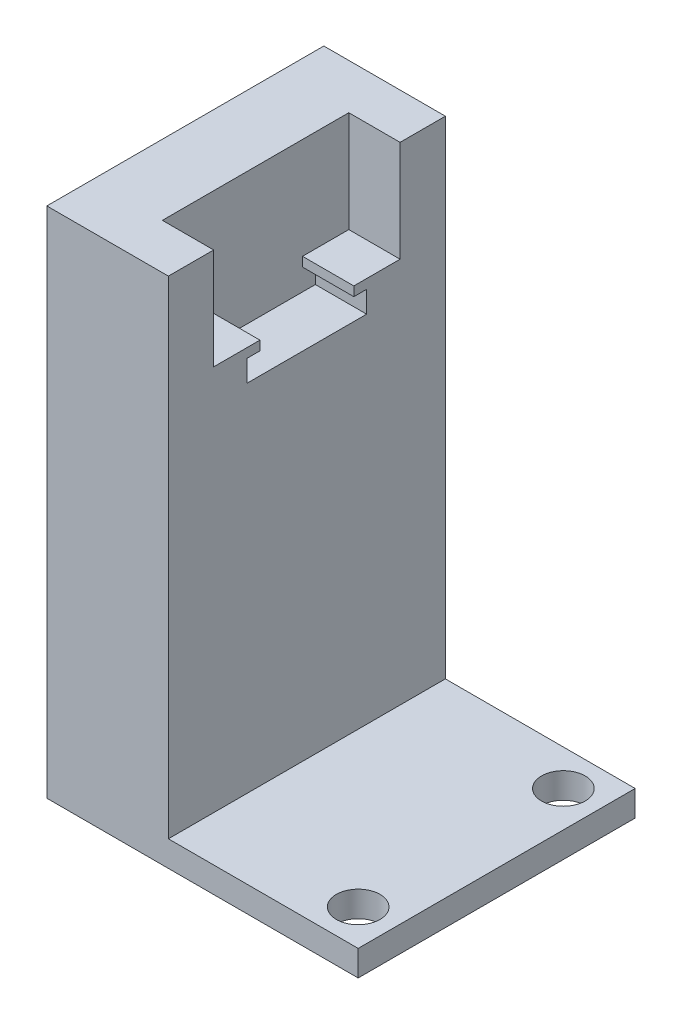
ISO-10303-21;
HEADER;
FILE_DESCRIPTION(('STEP AP214'),'2;1');
FILE_NAME('part.step','',(''),(''),'','','');
FILE_SCHEMA(('AUTOMOTIVE_DESIGN { 1 0 10303 214 1 1 1 1 }'));
ENDSEC;
DATA;
#1=APPLICATION_CONTEXT('core data for automotive mechanical design processes');
#2=APPLICATION_PROTOCOL_DEFINITION('international standard','automotive_design',2000,#1);
#3=PRODUCT_CONTEXT('',#1,'mechanical');
#4=PRODUCT('Part','Part','',(#3));
#5=PRODUCT_RELATED_PRODUCT_CATEGORY('part','',(#4));
#6=PRODUCT_DEFINITION_FORMATION('','',#4);
#7=PRODUCT_DEFINITION_CONTEXT('part definition',#1,'design');
#8=PRODUCT_DEFINITION('design','',#6,#7);
#9=PRODUCT_DEFINITION_SHAPE('','',#8);
#10=(LENGTH_UNIT() NAMED_UNIT(*) SI_UNIT(.MILLI.,.METRE.));
#11=(NAMED_UNIT(*) PLANE_ANGLE_UNIT() SI_UNIT($,.RADIAN.));
#12=(NAMED_UNIT(*) SI_UNIT($,.STERADIAN.) SOLID_ANGLE_UNIT());
#13=UNCERTAINTY_MEASURE_WITH_UNIT(LENGTH_MEASURE(1.E-05),#10,'distance_accuracy_value','');
#14=(GEOMETRIC_REPRESENTATION_CONTEXT(3) GLOBAL_UNCERTAINTY_ASSIGNED_CONTEXT((#13)) GLOBAL_UNIT_ASSIGNED_CONTEXT((#10,
#11,#12)) REPRESENTATION_CONTEXT('',''));
#15=CARTESIAN_POINT('',(0.,0.,0.));
#16=DIRECTION('',(0.,0.,1.));
#17=DIRECTION('',(1.,0.,0.));
#18=AXIS2_PLACEMENT_3D('',#15,#16,#17);
#19=CARTESIAN_POINT('',(0.,100.,0.));
#20=DIRECTION('',(0.,-1.,0.));
#21=DIRECTION('',(0.,0.,-1.));
#22=AXIS2_PLACEMENT_3D('',#19,#20,#21);
#23=PLANE('',#22);
#24=DIRECTION('',(-1.,0.,0.));
#25=VECTOR('',#24,1.);
#26=CARTESIAN_POINT('',(-42.195,100.,-27.));
#27=LINE('',#26,#25);
#28=CARTESIAN_POINT('',(5.19559700028005,100.,-27.));
#29=VERTEX_POINT('',#28);
#30=CARTESIAN_POINT('',(-18.49970149986,100.,-27.));
#31=VERTEX_POINT('',#30);
#32=EDGE_CURVE('E176',#29,#31,#27,.T.);
#33=ORIENTED_EDGE('',*,*,#32,.T.);
#34=DIRECTION('',(0.,0.,-1.));
#35=VECTOR('',#34,1.);
#36=CARTESIAN_POINT('',(-18.49970149986,100.,0.));
#37=LINE('',#36,#35);
#38=CARTESIAN_POINT('',(-18.49970149986,100.,27.));
#39=VERTEX_POINT('',#38);
#40=EDGE_CURVE('E167',#39,#31,#37,.T.);
#41=ORIENTED_EDGE('',*,*,#40,.F.);
#42=DIRECTION('',(1.,0.,0.));
#43=VECTOR('',#42,1.);
#44=CARTESIAN_POINT('',(-42.195,100.,27.));
#45=LINE('',#44,#43);
#46=CARTESIAN_POINT('',(5.19559700028004,100.,27.));
#47=VERTEX_POINT('',#46);
#48=EDGE_CURVE('E65',#39,#47,#45,.T.);
#49=ORIENTED_EDGE('',*,*,#48,.T.);
#50=DIRECTION('',(0.,0.,1.));
#51=VECTOR('',#50,1.);
#52=CARTESIAN_POINT('',(5.19559700028005,100.,-27.));
#53=LINE('',#52,#51);
#54=CARTESIAN_POINT('',(5.19559700028002,100.,18.1714474780213));
#55=VERTEX_POINT('',#54);
#56=EDGE_CURVE('E231',#55,#47,#53,.T.);
#57=ORIENTED_EDGE('',*,*,#56,.F.);
#58=DIRECTION('',(1.,0.,0.));
#59=VECTOR('',#58,1.);
#60=CARTESIAN_POINT('',(-4.80440299971998,100.,18.1714474780213));
#61=LINE('',#60,#59);
#62=CARTESIAN_POINT('',(-4.80440299971998,100.,18.1714474780213));
#63=VERTEX_POINT('',#62);
#64=EDGE_CURVE('E513',#63,#55,#61,.T.);
#65=ORIENTED_EDGE('',*,*,#64,.F.);
#66=DIRECTION('',(0.,0.,-1.));
#67=VECTOR('',#66,1.);
#68=CARTESIAN_POINT('',(-4.80440299971998,100.,-18.1714474780213));
#69=LINE('',#68,#67);
#70=CARTESIAN_POINT('',(-4.80440299971998,100.,-18.1714474780213));
#71=VERTEX_POINT('',#70);
#72=EDGE_CURVE('E531',#63,#71,#69,.T.);
#73=ORIENTED_EDGE('',*,*,#72,.T.);
#74=DIRECTION('',(1.,0.,0.));
#75=VECTOR('',#74,1.);
#76=CARTESIAN_POINT('',(-4.80440299971998,100.,-18.1714474780213));
#77=LINE('',#76,#75);
#78=CARTESIAN_POINT('',(5.19559700028002,100.,-18.1714474780213));
#79=VERTEX_POINT('',#78);
#80=EDGE_CURVE('E495',#71,#79,#77,.T.);
#81=ORIENTED_EDGE('',*,*,#80,.T.);
#82=EDGE_CURVE('E224',#29,#79,#53,.T.);
#83=ORIENTED_EDGE('',*,*,#82,.F.);
#84=EDGE_LOOP('',(#33,#41,#49,#57,#65,#73,#81,#83));
#85=FACE_BOUND('',#84,.T.);
#86=ADVANCED_FACE('F40',(#85),#23,.F.);
#87=CARTESIAN_POINT('',(5.19559700028005,-65.4595739547371,-27.));
#88=DIRECTION('',(-1.,0.,0.));
#89=DIRECTION('',(0.,0.,1.));
#90=AXIS2_PLACEMENT_3D('',#87,#88,#89);
#91=PLANE('',#90);
#92=DIRECTION('',(0.,0.,-1.));
#93=VECTOR('',#92,1.);
#94=CARTESIAN_POINT('',(5.19559700028002,80.2675565957331,9.15));
#95=LINE('',#94,#93);
#96=CARTESIAN_POINT('',(5.19559700028002,80.2675565957331,18.1714474780213));
#97=VERTEX_POINT('',#96);
#98=CARTESIAN_POINT('',(5.19559700028002,80.2675565957331,9.15));
#99=VERTEX_POINT('',#98);
#100=EDGE_CURVE('E594',#97,#99,#95,.T.);
#101=ORIENTED_EDGE('',*,*,#100,.F.);
#102=DIRECTION('',(0.,-1.,0.));
#103=VECTOR('',#102,1.);
#104=CARTESIAN_POINT('',(5.19559700028002,80.2675565957331,18.1714474780213));
#105=LINE('',#104,#103);
#106=EDGE_CURVE('E470',#55,#97,#105,.T.);
#107=ORIENTED_EDGE('',*,*,#106,.F.);
#108=ORIENTED_EDGE('',*,*,#56,.T.);
#109=DIRECTION('',(0.,1.,0.));
#110=VECTOR('',#109,1.);
#111=CARTESIAN_POINT('',(5.19559700028005,-65.4595739547371,27.));
#112=LINE('',#111,#110);
#113=CARTESIAN_POINT('',(5.19559700028005,5.,27.));
#114=VERTEX_POINT('',#113);
#115=EDGE_CURVE('E183',#114,#47,#112,.T.);
#116=ORIENTED_EDGE('',*,*,#115,.F.);
#117=DIRECTION('',(0.,0.,1.));
#118=VECTOR('',#117,1.);
#119=CARTESIAN_POINT('',(5.19559700028005,5.,-27.));
#120=LINE('',#119,#118);
#121=CARTESIAN_POINT('',(5.19559700028005,5.,-27.));
#122=VERTEX_POINT('',#121);
#123=EDGE_CURVE('E228',#122,#114,#120,.T.);
#124=ORIENTED_EDGE('',*,*,#123,.F.);
#125=DIRECTION('',(0.,1.,0.));
#126=VECTOR('',#125,1.);
#127=CARTESIAN_POINT('',(5.19559700028005,-65.4595739547371,-27.));
#128=LINE('',#127,#126);
#129=EDGE_CURVE('E220',#122,#29,#128,.T.);
#130=ORIENTED_EDGE('',*,*,#129,.T.);
#131=ORIENTED_EDGE('',*,*,#82,.T.);
#132=DIRECTION('',(0.,-1.,0.));
#133=VECTOR('',#132,1.);
#134=CARTESIAN_POINT('',(5.19559700028002,80.2675565957331,-18.1714474780213));
#135=LINE('',#134,#133);
#136=CARTESIAN_POINT('',(5.19559700028002,80.2675565957331,-18.1714474780213));
#137=VERTEX_POINT('',#136);
#138=EDGE_CURVE('E509',#79,#137,#135,.T.);
#139=ORIENTED_EDGE('',*,*,#138,.T.);
#140=DIRECTION('',(0.,0.,1.));
#141=VECTOR('',#140,1.);
#142=CARTESIAN_POINT('',(5.19559700028002,80.2675565957331,-9.15));
#143=LINE('',#142,#141);
#144=CARTESIAN_POINT('',(5.19559700028002,80.2675565957331,-9.15));
#145=VERTEX_POINT('',#144);
#146=EDGE_CURVE('E485',#137,#145,#143,.T.);
#147=ORIENTED_EDGE('',*,*,#146,.T.);
#148=DIRECTION('',(0.,-1.,0.));
#149=VECTOR('',#148,1.);
#150=CARTESIAN_POINT('',(5.19559700028002,78.45,-9.15));
#151=LINE('',#150,#149);
#152=CARTESIAN_POINT('',(5.19559700028002,78.45,-9.15));
#153=VERTEX_POINT('',#152);
#154=EDGE_CURVE('E523',#145,#153,#151,.T.);
#155=ORIENTED_EDGE('',*,*,#154,.T.);
#156=DIRECTION('',(0.,0.,-1.));
#157=VECTOR('',#156,1.);
#158=CARTESIAN_POINT('',(5.19559700028002,78.45,-11.65));
#159=LINE('',#158,#157);
#160=CARTESIAN_POINT('',(5.19559700028002,78.45,-11.65));
#161=VERTEX_POINT('',#160);
#162=EDGE_CURVE('E520',#153,#161,#159,.T.);
#163=ORIENTED_EDGE('',*,*,#162,.T.);
#164=DIRECTION('',(0.,-1.,0.));
#165=VECTOR('',#164,1.);
#166=CARTESIAN_POINT('',(5.19559700028002,74.25,-11.65));
#167=LINE('',#166,#165);
#168=CARTESIAN_POINT('',(5.19559700028002,74.25,-11.65));
#169=VERTEX_POINT('',#168);
#170=EDGE_CURVE('E516',#161,#169,#167,.T.);
#171=ORIENTED_EDGE('',*,*,#170,.T.);
#172=DIRECTION('',(0.,0.,1.));
#173=VECTOR('',#172,1.);
#174=CARTESIAN_POINT('',(5.19559700028002,74.25,0.));
#175=LINE('',#174,#173);
#176=CARTESIAN_POINT('',(5.19559700028002,74.25,11.65));
#177=VERTEX_POINT('',#176);
#178=EDGE_CURVE('E512',#169,#177,#175,.T.);
#179=ORIENTED_EDGE('',*,*,#178,.T.);
#180=DIRECTION('',(0.,-1.,0.));
#181=VECTOR('',#180,1.);
#182=CARTESIAN_POINT('',(5.19559700028002,74.25,11.65));
#183=LINE('',#182,#181);
#184=CARTESIAN_POINT('',(5.19559700028002,78.45,11.65));
#185=VERTEX_POINT('',#184);
#186=EDGE_CURVE('E565',#185,#177,#183,.T.);
#187=ORIENTED_EDGE('',*,*,#186,.F.);
#188=DIRECTION('',(0.,0.,1.));
#189=VECTOR('',#188,1.);
#190=CARTESIAN_POINT('',(5.19559700028002,78.45,11.65));
#191=LINE('',#190,#189);
#192=CARTESIAN_POINT('',(5.19559700028002,78.45,9.15));
#193=VERTEX_POINT('',#192);
#194=EDGE_CURVE('E600',#193,#185,#191,.T.);
#195=ORIENTED_EDGE('',*,*,#194,.F.);
#196=DIRECTION('',(0.,-1.,0.));
#197=VECTOR('',#196,1.);
#198=CARTESIAN_POINT('',(5.19559700028002,78.45,9.15));
#199=LINE('',#198,#197);
#200=EDGE_CURVE('E597',#99,#193,#199,.T.);
#201=ORIENTED_EDGE('',*,*,#200,.F.);
#202=EDGE_LOOP('',(#101,#107,#108,#116,#124,#130,#131,#139,#147,#155,#163,#171,#179,#187,#195,#201));
#203=FACE_BOUND('',#202,.T.);
#204=ADVANCED_FACE('F273',(#203),#91,.F.);
#205=CARTESIAN_POINT('',(0.,0.,0.));
#206=DIRECTION('',(0.,-1.,0.));
#207=DIRECTION('',(0.,0.,-1.));
#208=AXIS2_PLACEMENT_3D('',#205,#206,#207);
#209=PLANE('',#208);
#210=DIRECTION('',(0.,0.,-1.));
#211=VECTOR('',#210,1.);
#212=CARTESIAN_POINT('',(-18.49970149986,0.,0.));
#213=LINE('',#212,#211);
#214=CARTESIAN_POINT('',(-18.49970149986,0.,27.));
#215=VERTEX_POINT('',#214);
#216=CARTESIAN_POINT('',(-18.49970149986,0.,-27.));
#217=VERTEX_POINT('',#216);
#218=EDGE_CURVE('E57',#215,#217,#213,.T.);
#219=ORIENTED_EDGE('',*,*,#218,.T.);
#220=DIRECTION('',(-1.,0.,0.));
#221=VECTOR('',#220,1.);
#222=CARTESIAN_POINT('',(-42.195,0.,-27.));
#223=LINE('',#222,#221);
#224=CARTESIAN_POINT('',(42.195,0.,-27.));
#225=VERTEX_POINT('',#224);
#226=EDGE_CURVE('E198',#225,#217,#223,.T.);
#227=ORIENTED_EDGE('',*,*,#226,.F.);
#228=DIRECTION('',(0.,0.,-1.));
#229=VECTOR('',#228,1.);
#230=CARTESIAN_POINT('',(42.195,0.,27.));
#231=LINE('',#230,#229);
#232=CARTESIAN_POINT('',(42.195,0.,27.));
#233=VERTEX_POINT('',#232);
#234=EDGE_CURVE('E194',#233,#225,#231,.T.);
#235=ORIENTED_EDGE('',*,*,#234,.F.);
#236=DIRECTION('',(1.,0.,0.));
#237=VECTOR('',#236,1.);
#238=CARTESIAN_POINT('',(-42.195,0.,27.));
#239=LINE('',#238,#237);
#240=EDGE_CURVE('E190',#215,#233,#239,.T.);
#241=ORIENTED_EDGE('',*,*,#240,.F.);
#242=EDGE_LOOP('',(#219,#227,#235,#241));
#243=FACE_BOUND('',#242,.T.);
#244=CARTESIAN_POINT('',(35.195,0.,-20.));
#245=DIRECTION('',(0.,1.,0.));
#246=DIRECTION('',(0.,0.,1.));
#247=AXIS2_PLACEMENT_3D('',#244,#245,#246);
#248=CIRCLE('',#247,4.25);
#249=CARTESIAN_POINT('',(35.195,0.,-15.75));
#250=VERTEX_POINT('',#249);
#251=EDGE_CURVE('E199',#250,#250,#248,.T.);
#252=ORIENTED_EDGE('',*,*,#251,.T.);
#253=EDGE_LOOP('',(#252));
#254=FACE_BOUND('',#253,.T.);
#255=CARTESIAN_POINT('',(35.195,0.,20.));
#256=DIRECTION('',(0.,1.,0.));
#257=DIRECTION('',(0.,0.,1.));
#258=AXIS2_PLACEMENT_3D('',#255,#256,#257);
#259=CIRCLE('',#258,4.25);
#260=CARTESIAN_POINT('',(35.195,0.,24.25));
#261=VERTEX_POINT('',#260);
#262=EDGE_CURVE('E248',#261,#261,#259,.T.);
#263=ORIENTED_EDGE('',*,*,#262,.T.);
#264=EDGE_LOOP('',(#263));
#265=FACE_BOUND('',#264,.T.);
#266=ADVANCED_FACE('F212',(#243,#254,#265),#209,.T.);
#267=CARTESIAN_POINT('',(42.195,100.,27.));
#268=DIRECTION('',(-1.,0.,0.));
#269=DIRECTION('',(0.,0.,1.));
#270=AXIS2_PLACEMENT_3D('',#267,#268,#269);
#271=PLANE('',#270);
#272=DIRECTION('',(0.,-1.,0.));
#273=VECTOR('',#272,1.);
#274=CARTESIAN_POINT('',(42.195,100.,-27.));
#275=LINE('',#274,#273);
#276=CARTESIAN_POINT('',(42.195,5.,-27.));
#277=VERTEX_POINT('',#276);
#278=EDGE_CURVE('E12',#277,#225,#275,.T.);
#279=ORIENTED_EDGE('',*,*,#278,.F.);
#280=DIRECTION('',(0.,0.,-1.));
#281=VECTOR('',#280,1.);
#282=CARTESIAN_POINT('',(42.195,5.,-27.));
#283=LINE('',#282,#281);
#284=CARTESIAN_POINT('',(42.195,5.,27.));
#285=VERTEX_POINT('',#284);
#286=EDGE_CURVE('E210',#285,#277,#283,.T.);
#287=ORIENTED_EDGE('',*,*,#286,.F.);
#288=DIRECTION('',(0.,-1.,0.));
#289=VECTOR('',#288,1.);
#290=CARTESIAN_POINT('',(42.195,100.,27.));
#291=LINE('',#290,#289);
#292=EDGE_CURVE('E50',#285,#233,#291,.T.);
#293=ORIENTED_EDGE('',*,*,#292,.T.);
#294=ORIENTED_EDGE('',*,*,#234,.T.);
#295=EDGE_LOOP('',(#279,#287,#293,#294));
#296=FACE_BOUND('',#295,.T.);
#297=ADVANCED_FACE('F42',(#296),#271,.F.);
#298=CARTESIAN_POINT('',(-42.195,100.,-27.));
#299=DIRECTION('',(0.,0.,1.));
#300=DIRECTION('',(1.,0.,0.));
#301=AXIS2_PLACEMENT_3D('',#298,#299,#300);
#302=PLANE('',#301);
#303=ORIENTED_EDGE('',*,*,#226,.T.);
#304=DIRECTION('',(0.,-1.,0.));
#305=VECTOR('',#304,1.);
#306=CARTESIAN_POINT('',(-18.49970149986,0.,-27.));
#307=LINE('',#306,#305);
#308=EDGE_CURVE('E178',#31,#217,#307,.T.);
#309=ORIENTED_EDGE('',*,*,#308,.F.);
#310=ORIENTED_EDGE('',*,*,#32,.F.);
#311=ORIENTED_EDGE('',*,*,#129,.F.);
#312=DIRECTION('',(-1.,0.,0.));
#313=VECTOR('',#312,1.);
#314=CARTESIAN_POINT('',(42.195,5.,-27.));
#315=LINE('',#314,#313);
#316=EDGE_CURVE('E219',#277,#122,#315,.T.);
#317=ORIENTED_EDGE('',*,*,#316,.F.);
#318=ORIENTED_EDGE('',*,*,#278,.T.);
#319=EDGE_LOOP('',(#303,#309,#310,#311,#317,#318));
#320=FACE_BOUND('',#319,.T.);
#321=ADVANCED_FACE('F215',(#320),#302,.F.);
#322=CARTESIAN_POINT('',(-42.195,100.,27.));
#323=DIRECTION('',(0.,0.,-1.));
#324=DIRECTION('',(-1.,0.,0.));
#325=AXIS2_PLACEMENT_3D('',#322,#323,#324);
#326=PLANE('',#325);
#327=ORIENTED_EDGE('',*,*,#48,.F.);
#328=DIRECTION('',(0.,1.,0.));
#329=VECTOR('',#328,1.);
#330=CARTESIAN_POINT('',(-18.49970149986,0.,27.));
#331=LINE('',#330,#329);
#332=EDGE_CURVE('E165',#215,#39,#331,.T.);
#333=ORIENTED_EDGE('',*,*,#332,.F.);
#334=ORIENTED_EDGE('',*,*,#240,.T.);
#335=ORIENTED_EDGE('',*,*,#292,.F.);
#336=DIRECTION('',(1.,0.,0.));
#337=VECTOR('',#336,1.);
#338=CARTESIAN_POINT('',(42.195,5.,27.));
#339=LINE('',#338,#337);
#340=EDGE_CURVE('E237',#114,#285,#339,.T.);
#341=ORIENTED_EDGE('',*,*,#340,.F.);
#342=ORIENTED_EDGE('',*,*,#115,.T.);
#343=EDGE_LOOP('',(#327,#333,#334,#335,#341,#342));
#344=FACE_BOUND('',#343,.T.);
#345=ADVANCED_FACE('F181',(#344),#326,.F.);
#346=CARTESIAN_POINT('',(35.195,100.,-20.));
#347=DIRECTION('',(0.,-1.,0.));
#348=DIRECTION('',(0.,0.,-1.));
#349=AXIS2_PLACEMENT_3D('',#346,#347,#348);
#350=CYLINDRICAL_SURFACE('',#349,4.25);
#351=CARTESIAN_POINT('',(35.195,5.,-20.));
#352=DIRECTION('',(0.,-1.,0.));
#353=DIRECTION('',(0.,0.,-1.));
#354=AXIS2_PLACEMENT_3D('',#351,#352,#353);
#355=CIRCLE('',#354,4.25);
#356=CARTESIAN_POINT('',(35.195,5.,-24.25));
#357=VERTEX_POINT('',#356);
#358=EDGE_CURVE('E244',#357,#357,#355,.T.);
#359=ORIENTED_EDGE('',*,*,#358,.F.);
#360=EDGE_LOOP('',(#359));
#361=FACE_BOUND('',#360,.T.);
#362=ORIENTED_EDGE('',*,*,#251,.F.);
#363=EDGE_LOOP('',(#362));
#364=FACE_BOUND('',#363,.T.);
#365=ADVANCED_FACE('F256',(#361,#364),#350,.F.);
#366=CARTESIAN_POINT('',(35.195,100.,20.));
#367=DIRECTION('',(0.,-1.,0.));
#368=DIRECTION('',(0.,0.,-1.));
#369=AXIS2_PLACEMENT_3D('',#366,#367,#368);
#370=CYLINDRICAL_SURFACE('',#369,4.25);
#371=CARTESIAN_POINT('',(35.195,5.,20.));
#372=DIRECTION('',(0.,-1.,0.));
#373=DIRECTION('',(0.,0.,-1.));
#374=AXIS2_PLACEMENT_3D('',#371,#372,#373);
#375=CIRCLE('',#374,4.25);
#376=CARTESIAN_POINT('',(35.195,5.,15.75));
#377=VERTEX_POINT('',#376);
#378=EDGE_CURVE('E44',#377,#377,#375,.T.);
#379=ORIENTED_EDGE('',*,*,#378,.F.);
#380=EDGE_LOOP('',(#379));
#381=FACE_BOUND('',#380,.T.);
#382=ORIENTED_EDGE('',*,*,#262,.F.);
#383=EDGE_LOOP('',(#382));
#384=FACE_BOUND('',#383,.T.);
#385=ADVANCED_FACE('F258',(#381,#384),#370,.F.);
#386=CARTESIAN_POINT('',(0.,5.,0.));
#387=DIRECTION('',(0.,-1.,0.));
#388=DIRECTION('',(0.,0.,-1.));
#389=AXIS2_PLACEMENT_3D('',#386,#387,#388);
#390=PLANE('',#389);
#391=ORIENTED_EDGE('',*,*,#358,.T.);
#392=EDGE_LOOP('',(#391));
#393=FACE_BOUND('',#392,.T.);
#394=ORIENTED_EDGE('',*,*,#378,.T.);
#395=EDGE_LOOP('',(#394));
#396=FACE_BOUND('',#395,.T.);
#397=ORIENTED_EDGE('',*,*,#286,.T.);
#398=ORIENTED_EDGE('',*,*,#316,.T.);
#399=ORIENTED_EDGE('',*,*,#123,.T.);
#400=ORIENTED_EDGE('',*,*,#340,.T.);
#401=EDGE_LOOP('',(#397,#398,#399,#400));
#402=FACE_BOUND('',#401,.T.);
#403=ADVANCED_FACE('F265',(#393,#396,#402),#390,.F.);
#404=CARTESIAN_POINT('',(-4.80440299971998,80.2675565957331,-18.1714474780213));
#405=DIRECTION('',(0.,0.,1.));
#406=DIRECTION('',(1.,0.,0.));
#407=AXIS2_PLACEMENT_3D('',#404,#405,#406);
#408=PLANE('',#407);
#409=ORIENTED_EDGE('',*,*,#138,.F.);
#410=ORIENTED_EDGE('',*,*,#80,.F.);
#411=DIRECTION('',(0.,-1.,0.));
#412=VECTOR('',#411,1.);
#413=CARTESIAN_POINT('',(-4.80440299971998,80.2675565957331,-18.1714474780213));
#414=LINE('',#413,#412);
#415=CARTESIAN_POINT('',(-4.80440299971998,80.2675565957331,-18.1714474780213));
#416=VERTEX_POINT('',#415);
#417=EDGE_CURVE('E529',#71,#416,#414,.T.);
#418=ORIENTED_EDGE('',*,*,#417,.T.);
#419=DIRECTION('',(1.,0.,0.));
#420=VECTOR('',#419,1.);
#421=CARTESIAN_POINT('',(-4.80440299971998,80.2675565957331,-18.1714474780213));
#422=LINE('',#421,#420);
#423=EDGE_CURVE('E473',#416,#137,#422,.T.);
#424=ORIENTED_EDGE('',*,*,#423,.T.);
#425=EDGE_LOOP('',(#409,#410,#418,#424));
#426=FACE_BOUND('',#425,.T.);
#427=ADVANCED_FACE('F395',(#426),#408,.T.);
#428=CARTESIAN_POINT('',(-4.80440299971998,80.2675565957331,-9.15));
#429=DIRECTION('',(0.,1.,0.));
#430=DIRECTION('',(0.,0.,1.));
#431=AXIS2_PLACEMENT_3D('',#428,#429,#430);
#432=PLANE('',#431);
#433=ORIENTED_EDGE('',*,*,#146,.F.);
#434=ORIENTED_EDGE('',*,*,#423,.F.);
#435=DIRECTION('',(0.,0.,1.));
#436=VECTOR('',#435,1.);
#437=CARTESIAN_POINT('',(-4.80440299971998,80.2675565957331,-9.15));
#438=LINE('',#437,#436);
#439=CARTESIAN_POINT('',(-4.80440299971998,80.2675565957331,-9.15));
#440=VERTEX_POINT('',#439);
#441=EDGE_CURVE('E498',#416,#440,#438,.T.);
#442=ORIENTED_EDGE('',*,*,#441,.T.);
#443=DIRECTION('',(1.,0.,0.));
#444=VECTOR('',#443,1.);
#445=CARTESIAN_POINT('',(-4.80440299971998,80.2675565957331,-9.15));
#446=LINE('',#445,#444);
#447=EDGE_CURVE('E476',#440,#145,#446,.T.);
#448=ORIENTED_EDGE('',*,*,#447,.T.);
#449=EDGE_LOOP('',(#433,#434,#442,#448));
#450=FACE_BOUND('',#449,.T.);
#451=ADVANCED_FACE('F387',(#450),#432,.T.);
#452=CARTESIAN_POINT('',(-4.80440299971998,78.45,-9.15));
#453=DIRECTION('',(0.,0.,1.));
#454=DIRECTION('',(1.,0.,0.));
#455=AXIS2_PLACEMENT_3D('',#452,#453,#454);
#456=PLANE('',#455);
#457=ORIENTED_EDGE('',*,*,#154,.F.);
#458=ORIENTED_EDGE('',*,*,#447,.F.);
#459=DIRECTION('',(0.,-1.,0.));
#460=VECTOR('',#459,1.);
#461=CARTESIAN_POINT('',(-4.80440299971998,78.45,-9.15));
#462=LINE('',#461,#460);
#463=CARTESIAN_POINT('',(-4.80440299971998,78.45,-9.15));
#464=VERTEX_POINT('',#463);
#465=EDGE_CURVE('E501',#440,#464,#462,.T.);
#466=ORIENTED_EDGE('',*,*,#465,.T.);
#467=DIRECTION('',(1.,0.,0.));
#468=VECTOR('',#467,1.);
#469=CARTESIAN_POINT('',(-4.80440299971998,78.45,-9.15));
#470=LINE('',#469,#468);
#471=EDGE_CURVE('E482',#464,#153,#470,.T.);
#472=ORIENTED_EDGE('',*,*,#471,.T.);
#473=EDGE_LOOP('',(#457,#458,#466,#472));
#474=FACE_BOUND('',#473,.T.);
#475=ADVANCED_FACE('F379',(#474),#456,.T.);
#476=CARTESIAN_POINT('',(-4.80440299971998,78.45,-11.65));
#477=DIRECTION('',(0.,-1.,0.));
#478=DIRECTION('',(0.,0.,-1.));
#479=AXIS2_PLACEMENT_3D('',#476,#477,#478);
#480=PLANE('',#479);
#481=ORIENTED_EDGE('',*,*,#162,.F.);
#482=ORIENTED_EDGE('',*,*,#471,.F.);
#483=DIRECTION('',(0.,0.,-1.));
#484=VECTOR('',#483,1.);
#485=CARTESIAN_POINT('',(-4.80440299971998,78.45,-11.65));
#486=LINE('',#485,#484);
#487=CARTESIAN_POINT('',(-4.80440299971998,78.45,-11.65));
#488=VERTEX_POINT('',#487);
#489=EDGE_CURVE('E505',#464,#488,#486,.T.);
#490=ORIENTED_EDGE('',*,*,#489,.T.);
#491=DIRECTION('',(1.,0.,0.));
#492=VECTOR('',#491,1.);
#493=CARTESIAN_POINT('',(-4.80440299971998,78.45,-11.65));
#494=LINE('',#493,#492);
#495=EDGE_CURVE('E490',#488,#161,#494,.T.);
#496=ORIENTED_EDGE('',*,*,#495,.T.);
#497=EDGE_LOOP('',(#481,#482,#490,#496));
#498=FACE_BOUND('',#497,.T.);
#499=ADVANCED_FACE('F371',(#498),#480,.T.);
#500=CARTESIAN_POINT('',(-4.80440299971998,74.25,-11.65));
#501=DIRECTION('',(0.,0.,1.));
#502=DIRECTION('',(0.,-1.,0.));
#503=AXIS2_PLACEMENT_3D('',#500,#501,#502);
#504=PLANE('',#503);
#505=ORIENTED_EDGE('',*,*,#170,.F.);
#506=ORIENTED_EDGE('',*,*,#495,.F.);
#507=DIRECTION('',(0.,-1.,0.));
#508=VECTOR('',#507,1.);
#509=CARTESIAN_POINT('',(-4.80440299971998,74.25,-11.65));
#510=LINE('',#509,#508);
#511=CARTESIAN_POINT('',(-4.80440299971998,74.25,-11.65));
#512=VERTEX_POINT('',#511);
#513=EDGE_CURVE('E543',#488,#512,#510,.T.);
#514=ORIENTED_EDGE('',*,*,#513,.T.);
#515=DIRECTION('',(1.,0.,0.));
#516=VECTOR('',#515,1.);
#517=CARTESIAN_POINT('',(-4.80440299971998,74.25,-11.65));
#518=LINE('',#517,#516);
#519=EDGE_CURVE('E493',#512,#169,#518,.T.);
#520=ORIENTED_EDGE('',*,*,#519,.T.);
#521=EDGE_LOOP('',(#505,#506,#514,#520));
#522=FACE_BOUND('',#521,.T.);
#523=ADVANCED_FACE('F363',(#522),#504,.T.);
#524=CARTESIAN_POINT('',(-4.80440299971998,74.25,0.));
#525=DIRECTION('',(0.,1.,0.));
#526=DIRECTION('',(0.,0.,1.));
#527=AXIS2_PLACEMENT_3D('',#524,#525,#526);
#528=PLANE('',#527);
#529=ORIENTED_EDGE('',*,*,#178,.F.);
#530=ORIENTED_EDGE('',*,*,#519,.F.);
#531=DIRECTION('',(0.,0.,1.));
#532=VECTOR('',#531,1.);
#533=CARTESIAN_POINT('',(-4.80440299971998,74.25,0.));
#534=LINE('',#533,#532);
#535=CARTESIAN_POINT('',(-4.80440299971998,74.25,11.65));
#536=VERTEX_POINT('',#535);
#537=EDGE_CURVE('E535',#512,#536,#534,.T.);
#538=ORIENTED_EDGE('',*,*,#537,.T.);
#539=DIRECTION('',(1.,0.,0.));
#540=VECTOR('',#539,1.);
#541=CARTESIAN_POINT('',(-4.80440299971998,74.25,11.65));
#542=LINE('',#541,#540);
#543=EDGE_CURVE('E562',#536,#177,#542,.T.);
#544=ORIENTED_EDGE('',*,*,#543,.T.);
#545=EDGE_LOOP('',(#529,#530,#538,#544));
#546=FACE_BOUND('',#545,.T.);
#547=ADVANCED_FACE('F355',(#546),#528,.T.);
#548=CARTESIAN_POINT('',(-4.80440299971998,0.,0.));
#549=DIRECTION('',(-1.,0.,0.));
#550=DIRECTION('',(0.,0.,-1.));
#551=AXIS2_PLACEMENT_3D('',#548,#549,#550);
#552=PLANE('',#551);
#553=ORIENTED_EDGE('',*,*,#417,.F.);
#554=ORIENTED_EDGE('',*,*,#72,.F.);
#555=DIRECTION('',(0.,-1.,0.));
#556=VECTOR('',#555,1.);
#557=CARTESIAN_POINT('',(-4.80440299971998,80.2675565957331,18.1714474780213));
#558=LINE('',#557,#556);
#559=CARTESIAN_POINT('',(-4.80440299971998,80.2675565957331,18.1714474780213));
#560=VERTEX_POINT('',#559);
#561=EDGE_CURVE('E604',#63,#560,#558,.T.);
#562=ORIENTED_EDGE('',*,*,#561,.T.);
#563=DIRECTION('',(0.,0.,-1.));
#564=VECTOR('',#563,1.);
#565=CARTESIAN_POINT('',(-4.80440299971998,80.2675565957331,9.15));
#566=LINE('',#565,#564);
#567=CARTESIAN_POINT('',(-4.80440299971998,80.2675565957331,9.15));
#568=VERTEX_POINT('',#567);
#569=EDGE_CURVE('E607',#560,#568,#566,.T.);
#570=ORIENTED_EDGE('',*,*,#569,.T.);
#571=DIRECTION('',(0.,-1.,0.));
#572=VECTOR('',#571,1.);
#573=CARTESIAN_POINT('',(-4.80440299971998,78.45,9.15));
#574=LINE('',#573,#572);
#575=CARTESIAN_POINT('',(-4.80440299971998,78.45,9.15));
#576=VERTEX_POINT('',#575);
#577=EDGE_CURVE('E588',#568,#576,#574,.T.);
#578=ORIENTED_EDGE('',*,*,#577,.T.);
#579=DIRECTION('',(0.,0.,1.));
#580=VECTOR('',#579,1.);
#581=CARTESIAN_POINT('',(-4.80440299971998,78.45,11.65));
#582=LINE('',#581,#580);
#583=CARTESIAN_POINT('',(-4.80440299971998,78.45,11.65));
#584=VERTEX_POINT('',#583);
#585=EDGE_CURVE('E585',#576,#584,#582,.T.);
#586=ORIENTED_EDGE('',*,*,#585,.T.);
#587=DIRECTION('',(0.,-1.,0.));
#588=VECTOR('',#587,1.);
#589=CARTESIAN_POINT('',(-4.80440299971998,74.25,11.65));
#590=LINE('',#589,#588);
#591=EDGE_CURVE('E558',#584,#536,#590,.T.);
#592=ORIENTED_EDGE('',*,*,#591,.T.);
#593=ORIENTED_EDGE('',*,*,#537,.F.);
#594=ORIENTED_EDGE('',*,*,#513,.F.);
#595=ORIENTED_EDGE('',*,*,#489,.F.);
#596=ORIENTED_EDGE('',*,*,#465,.F.);
#597=ORIENTED_EDGE('',*,*,#441,.F.);
#598=EDGE_LOOP('',(#553,#554,#562,#570,#578,#586,#592,#593,#594,#595,#596,#597));
#599=FACE_BOUND('',#598,.T.);
#600=ADVANCED_FACE('F347',(#599),#552,.F.);
#601=CARTESIAN_POINT('',(-4.80440299971998,80.2675565957331,18.1714474780213));
#602=DIRECTION('',(0.,0.,1.));
#603=DIRECTION('',(1.,0.,0.));
#604=AXIS2_PLACEMENT_3D('',#601,#602,#603);
#605=PLANE('',#604);
#606=ORIENTED_EDGE('',*,*,#106,.T.);
#607=DIRECTION('',(1.,0.,0.));
#608=VECTOR('',#607,1.);
#609=CARTESIAN_POINT('',(-4.80440299971998,80.2675565957331,18.1714474780213));
#610=LINE('',#609,#608);
#611=EDGE_CURVE('E538',#560,#97,#610,.T.);
#612=ORIENTED_EDGE('',*,*,#611,.F.);
#613=ORIENTED_EDGE('',*,*,#561,.F.);
#614=ORIENTED_EDGE('',*,*,#64,.T.);
#615=EDGE_LOOP('',(#606,#612,#613,#614));
#616=FACE_BOUND('',#615,.T.);
#617=ADVANCED_FACE('F339',(#616),#605,.F.);
#618=CARTESIAN_POINT('',(-4.80440299971998,74.25,11.65));
#619=DIRECTION('',(0.,0.,1.));
#620=DIRECTION('',(0.,-1.,0.));
#621=AXIS2_PLACEMENT_3D('',#618,#619,#620);
#622=PLANE('',#621);
#623=ORIENTED_EDGE('',*,*,#186,.T.);
#624=ORIENTED_EDGE('',*,*,#543,.F.);
#625=ORIENTED_EDGE('',*,*,#591,.F.);
#626=DIRECTION('',(1.,0.,0.));
#627=VECTOR('',#626,1.);
#628=CARTESIAN_POINT('',(-4.80440299971998,78.45,11.65));
#629=LINE('',#628,#627);
#630=EDGE_CURVE('E567',#584,#185,#629,.T.);
#631=ORIENTED_EDGE('',*,*,#630,.T.);
#632=EDGE_LOOP('',(#623,#624,#625,#631));
#633=FACE_BOUND('',#632,.T.);
#634=ADVANCED_FACE('F331',(#633),#622,.F.);
#635=CARTESIAN_POINT('',(-4.80440299971998,78.45,11.65));
#636=DIRECTION('',(0.,1.,0.));
#637=DIRECTION('',(0.,0.,1.));
#638=AXIS2_PLACEMENT_3D('',#635,#636,#637);
#639=PLANE('',#638);
#640=ORIENTED_EDGE('',*,*,#194,.T.);
#641=ORIENTED_EDGE('',*,*,#630,.F.);
#642=ORIENTED_EDGE('',*,*,#585,.F.);
#643=DIRECTION('',(1.,0.,0.));
#644=VECTOR('',#643,1.);
#645=CARTESIAN_POINT('',(-4.80440299971998,78.45,9.15));
#646=LINE('',#645,#644);
#647=EDGE_CURVE('E572',#576,#193,#646,.T.);
#648=ORIENTED_EDGE('',*,*,#647,.T.);
#649=EDGE_LOOP('',(#640,#641,#642,#648));
#650=FACE_BOUND('',#649,.T.);
#651=ADVANCED_FACE('F323',(#650),#639,.F.);
#652=CARTESIAN_POINT('',(-4.80440299971998,78.45,9.15));
#653=DIRECTION('',(0.,0.,1.));
#654=DIRECTION('',(1.,0.,0.));
#655=AXIS2_PLACEMENT_3D('',#652,#653,#654);
#656=PLANE('',#655);
#657=ORIENTED_EDGE('',*,*,#200,.T.);
#658=ORIENTED_EDGE('',*,*,#647,.F.);
#659=ORIENTED_EDGE('',*,*,#577,.F.);
#660=DIRECTION('',(1.,0.,0.));
#661=VECTOR('',#660,1.);
#662=CARTESIAN_POINT('',(-4.80440299971998,80.2675565957331,9.15));
#663=LINE('',#662,#661);
#664=EDGE_CURVE('E577',#568,#99,#663,.T.);
#665=ORIENTED_EDGE('',*,*,#664,.T.);
#666=EDGE_LOOP('',(#657,#658,#659,#665));
#667=FACE_BOUND('',#666,.T.);
#668=ADVANCED_FACE('F316',(#667),#656,.F.);
#669=CARTESIAN_POINT('',(-4.80440299971998,80.2675565957331,9.15));
#670=DIRECTION('',(0.,-1.,0.));
#671=DIRECTION('',(0.,0.,-1.));
#672=AXIS2_PLACEMENT_3D('',#669,#670,#671);
#673=PLANE('',#672);
#674=ORIENTED_EDGE('',*,*,#100,.T.);
#675=ORIENTED_EDGE('',*,*,#664,.F.);
#676=ORIENTED_EDGE('',*,*,#569,.F.);
#677=ORIENTED_EDGE('',*,*,#611,.T.);
#678=EDGE_LOOP('',(#674,#675,#676,#677));
#679=FACE_BOUND('',#678,.T.);
#680=ADVANCED_FACE('F307',(#679),#673,.F.);
#681=CARTESIAN_POINT('',(-18.49970149986,0.,0.));
#682=DIRECTION('',(1.,0.,0.));
#683=DIRECTION('',(0.,0.,-1.));
#684=AXIS2_PLACEMENT_3D('',#681,#682,#683);
#685=PLANE('',#684);
#686=ORIENTED_EDGE('',*,*,#308,.T.);
#687=ORIENTED_EDGE('',*,*,#218,.F.);
#688=ORIENTED_EDGE('',*,*,#332,.T.);
#689=ORIENTED_EDGE('',*,*,#40,.T.);
#690=EDGE_LOOP('',(#686,#687,#688,#689));
#691=FACE_BOUND('',#690,.T.);
#692=ADVANCED_FACE('F166',(#691),#685,.F.);
#693=CLOSED_SHELL('',(#86,#204,#266,#297,#321,#345,#365,#385,#403,#427,#451,#475,#499,#523,#547,
#600,#617,#634,#651,#668,#680,#692));
#694=MANIFOLD_SOLID_BREP('B2',#693);
#695=ADVANCED_BREP_SHAPE_REPRESENTATION('',(#18,#694),#14);
#696=SHAPE_DEFINITION_REPRESENTATION(#9,#695);
ENDSEC;
END-ISO-10303-21;
